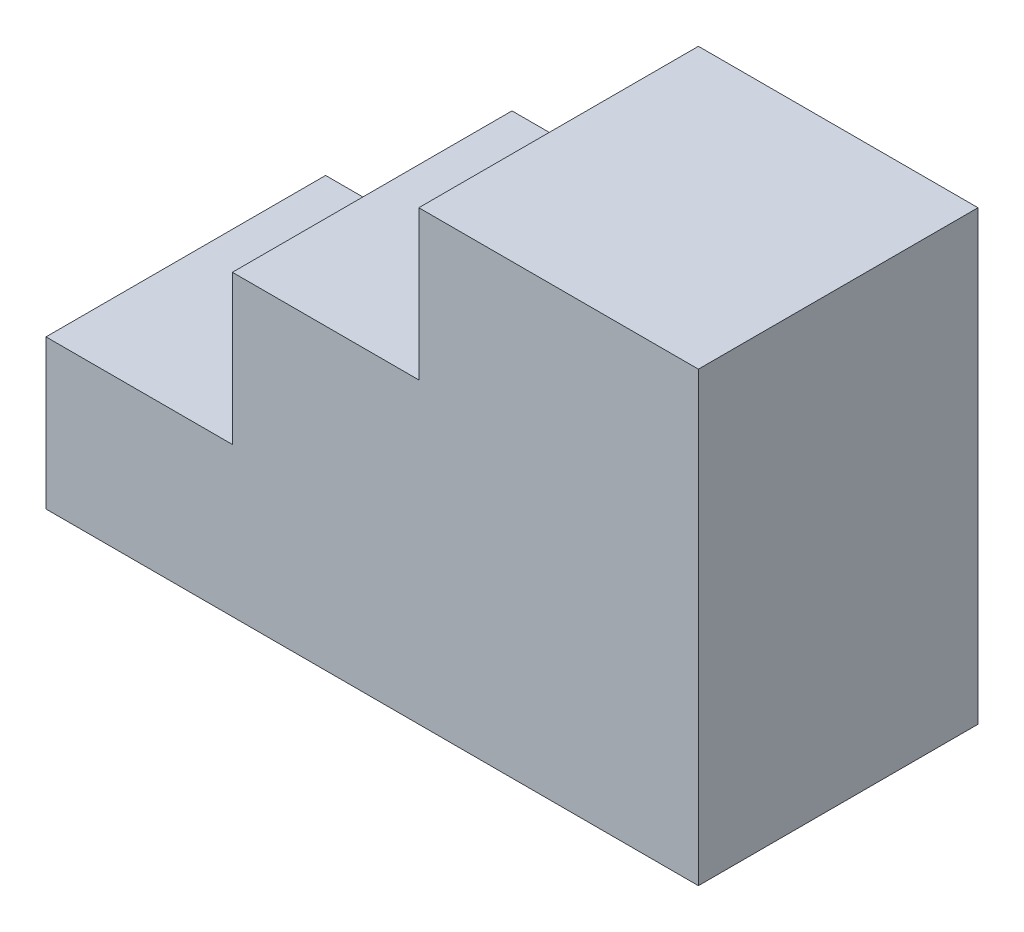
ISO-10303-21;
HEADER;
FILE_DESCRIPTION(('STEP AP214'),'2;1');
FILE_NAME('part.step','',(''),(''),'','','');
FILE_SCHEMA(('AUTOMOTIVE_DESIGN { 1 0 10303 214 1 1 1 1 }'));
ENDSEC;
DATA;
#1=APPLICATION_CONTEXT('core data for automotive mechanical design processes');
#2=APPLICATION_PROTOCOL_DEFINITION('international standard','automotive_design',2000,#1);
#3=PRODUCT_CONTEXT('',#1,'mechanical');
#4=PRODUCT('Part','Part','',(#3));
#5=PRODUCT_RELATED_PRODUCT_CATEGORY('part','',(#4));
#6=PRODUCT_DEFINITION_FORMATION('','',#4);
#7=PRODUCT_DEFINITION_CONTEXT('part definition',#1,'design');
#8=PRODUCT_DEFINITION('design','',#6,#7);
#9=PRODUCT_DEFINITION_SHAPE('','',#8);
#10=(LENGTH_UNIT() NAMED_UNIT(*) SI_UNIT(.MILLI.,.METRE.));
#11=(NAMED_UNIT(*) PLANE_ANGLE_UNIT() SI_UNIT($,.RADIAN.));
#12=(NAMED_UNIT(*) SI_UNIT($,.STERADIAN.) SOLID_ANGLE_UNIT());
#13=UNCERTAINTY_MEASURE_WITH_UNIT(LENGTH_MEASURE(1.E-05),#10,'distance_accuracy_value','');
#14=(GEOMETRIC_REPRESENTATION_CONTEXT(3) GLOBAL_UNCERTAINTY_ASSIGNED_CONTEXT((#13)) GLOBAL_UNIT_ASSIGNED_CONTEXT((#10,
#11,#12)) REPRESENTATION_CONTEXT('',''));
#15=CARTESIAN_POINT('',(0.,0.,0.));
#16=DIRECTION('',(0.,0.,1.));
#17=DIRECTION('',(1.,0.,0.));
#18=AXIS2_PLACEMENT_3D('',#15,#16,#17);
#19=CARTESIAN_POINT('',(-87.5,40.,37.5));
#20=DIRECTION('',(1.,0.,0.));
#21=DIRECTION('',(0.,0.,-1.));
#22=AXIS2_PLACEMENT_3D('',#19,#20,#21);
#23=PLANE('',#22);
#24=DIRECTION('',(0.,-1.,0.));
#25=VECTOR('',#24,1.);
#26=CARTESIAN_POINT('',(-87.5,40.,-37.5));
#27=LINE('',#26,#25);
#28=CARTESIAN_POINT('',(-87.5,40.,-37.5));
#29=VERTEX_POINT('',#28);
#30=CARTESIAN_POINT('',(-87.5,0.,-37.5));
#31=VERTEX_POINT('',#30);
#32=EDGE_CURVE('E135',#29,#31,#27,.T.);
#33=ORIENTED_EDGE('',*,*,#32,.T.);
#34=DIRECTION('',(0.,0.,-1.));
#35=VECTOR('',#34,1.);
#36=CARTESIAN_POINT('',(-87.5,0.,37.5));
#37=LINE('',#36,#35);
#38=CARTESIAN_POINT('',(-87.5,0.,37.5));
#39=VERTEX_POINT('',#38);
#40=EDGE_CURVE('E11',#39,#31,#37,.T.);
#41=ORIENTED_EDGE('',*,*,#40,.F.);
#42=DIRECTION('',(0.,-1.,0.));
#43=VECTOR('',#42,1.);
#44=CARTESIAN_POINT('',(-87.5,40.,37.5));
#45=LINE('',#44,#43);
#46=CARTESIAN_POINT('',(-87.5,40.,37.5));
#47=VERTEX_POINT('',#46);
#48=EDGE_CURVE('E150',#47,#39,#45,.T.);
#49=ORIENTED_EDGE('',*,*,#48,.F.);
#50=DIRECTION('',(0.,0.,-1.));
#51=VECTOR('',#50,1.);
#52=CARTESIAN_POINT('',(-87.5,40.,37.5));
#53=LINE('',#52,#51);
#54=EDGE_CURVE('E131',#47,#29,#53,.T.);
#55=ORIENTED_EDGE('',*,*,#54,.T.);
#56=EDGE_LOOP('',(#33,#41,#49,#55));
#57=FACE_BOUND('',#56,.T.);
#58=ADVANCED_FACE('F39',(#57),#23,.F.);
#59=CARTESIAN_POINT('',(-87.5,0.,37.5));
#60=DIRECTION('',(0.,1.,0.));
#61=DIRECTION('',(0.,0.,1.));
#62=AXIS2_PLACEMENT_3D('',#59,#60,#61);
#63=PLANE('',#62);
#64=CARTESIAN_POINT('',(-50.,0.,0.));
#65=DIRECTION('',(0.,1.,0.));
#66=DIRECTION('',(0.,0.,1.));
#67=AXIS2_PLACEMENT_3D('',#64,#65,#66);
#68=CIRCLE('',#67,4.);
#69=CARTESIAN_POINT('',(-50.,0.,4.));
#70=VERTEX_POINT('',#69);
#71=EDGE_CURVE('E189',#70,#70,#68,.T.);
#72=ORIENTED_EDGE('',*,*,#71,.T.);
#73=EDGE_LOOP('',(#72));
#74=FACE_BOUND('',#73,.T.);
#75=CARTESIAN_POINT('',(50.,0.,0.));
#76=DIRECTION('',(0.,1.,0.));
#77=DIRECTION('',(0.,0.,1.));
#78=AXIS2_PLACEMENT_3D('',#75,#76,#77);
#79=CIRCLE('',#78,4.);
#80=CARTESIAN_POINT('',(50.,0.,4.));
#81=VERTEX_POINT('',#80);
#82=EDGE_CURVE('E186',#81,#81,#79,.T.);
#83=ORIENTED_EDGE('',*,*,#82,.T.);
#84=EDGE_LOOP('',(#83));
#85=FACE_BOUND('',#84,.T.);
#86=DIRECTION('',(1.,0.,0.));
#87=VECTOR('',#86,1.);
#88=CARTESIAN_POINT('',(-87.5,0.,-37.5));
#89=LINE('',#88,#87);
#90=CARTESIAN_POINT('',(87.5,0.,-37.5));
#91=VERTEX_POINT('',#90);
#92=EDGE_CURVE('E138',#31,#91,#89,.T.);
#93=ORIENTED_EDGE('',*,*,#92,.T.);
#94=DIRECTION('',(0.,0.,-1.));
#95=VECTOR('',#94,1.);
#96=CARTESIAN_POINT('',(87.5,0.,37.5));
#97=LINE('',#96,#95);
#98=CARTESIAN_POINT('',(87.5,0.,37.5));
#99=VERTEX_POINT('',#98);
#100=EDGE_CURVE('E47',#99,#91,#97,.T.);
#101=ORIENTED_EDGE('',*,*,#100,.F.);
#102=DIRECTION('',(1.,0.,0.));
#103=VECTOR('',#102,1.);
#104=CARTESIAN_POINT('',(-87.5,0.,37.5));
#105=LINE('',#104,#103);
#106=EDGE_CURVE('E98',#39,#99,#105,.T.);
#107=ORIENTED_EDGE('',*,*,#106,.F.);
#108=ORIENTED_EDGE('',*,*,#40,.T.);
#109=EDGE_LOOP('',(#93,#101,#107,#108));
#110=FACE_BOUND('',#109,.T.);
#111=ADVANCED_FACE('F207',(#74,#85,#110),#63,.F.);
#112=CARTESIAN_POINT('',(87.5,0.,37.5));
#113=DIRECTION('',(-1.,0.,0.));
#114=DIRECTION('',(0.,0.,1.));
#115=AXIS2_PLACEMENT_3D('',#112,#113,#114);
#116=PLANE('',#115);
#117=DIRECTION('',(0.,1.,0.));
#118=VECTOR('',#117,1.);
#119=CARTESIAN_POINT('',(87.5,0.,-37.5));
#120=LINE('',#119,#118);
#121=CARTESIAN_POINT('',(87.5,120.,-37.5));
#122=VERTEX_POINT('',#121);
#123=EDGE_CURVE('E141',#91,#122,#120,.T.);
#124=ORIENTED_EDGE('',*,*,#123,.T.);
#125=DIRECTION('',(0.,0.,-1.));
#126=VECTOR('',#125,1.);
#127=CARTESIAN_POINT('',(87.5,120.,37.5));
#128=LINE('',#127,#126);
#129=CARTESIAN_POINT('',(87.5,120.,37.5));
#130=VERTEX_POINT('',#129);
#131=EDGE_CURVE('E157',#130,#122,#128,.T.);
#132=ORIENTED_EDGE('',*,*,#131,.F.);
#133=DIRECTION('',(0.,1.,0.));
#134=VECTOR('',#133,1.);
#135=CARTESIAN_POINT('',(87.5,0.,37.5));
#136=LINE('',#135,#134);
#137=EDGE_CURVE('E165',#99,#130,#136,.T.);
#138=ORIENTED_EDGE('',*,*,#137,.F.);
#139=ORIENTED_EDGE('',*,*,#100,.T.);
#140=EDGE_LOOP('',(#124,#132,#138,#139));
#141=FACE_BOUND('',#140,.T.);
#142=ADVANCED_FACE('F163',(#141),#116,.F.);
#143=CARTESIAN_POINT('',(87.5,120.,37.5));
#144=DIRECTION('',(0.,-1.,0.));
#145=DIRECTION('',(0.,0.,-1.));
#146=AXIS2_PLACEMENT_3D('',#143,#144,#145);
#147=PLANE('',#146);
#148=DIRECTION('',(-1.,0.,0.));
#149=VECTOR('',#148,1.);
#150=CARTESIAN_POINT('',(87.5,120.,-37.5));
#151=LINE('',#150,#149);
#152=CARTESIAN_POINT('',(12.5,120.,-37.5));
#153=VERTEX_POINT('',#152);
#154=EDGE_CURVE('E143',#122,#153,#151,.T.);
#155=ORIENTED_EDGE('',*,*,#154,.T.);
#156=DIRECTION('',(0.,0.,-1.));
#157=VECTOR('',#156,1.);
#158=CARTESIAN_POINT('',(12.5,120.,37.5));
#159=LINE('',#158,#157);
#160=CARTESIAN_POINT('',(12.5,120.,37.5));
#161=VERTEX_POINT('',#160);
#162=EDGE_CURVE('E154',#161,#153,#159,.T.);
#163=ORIENTED_EDGE('',*,*,#162,.F.);
#164=DIRECTION('',(-1.,0.,0.));
#165=VECTOR('',#164,1.);
#166=CARTESIAN_POINT('',(87.5,120.,37.5));
#167=LINE('',#166,#165);
#168=EDGE_CURVE('E177',#130,#161,#167,.T.);
#169=ORIENTED_EDGE('',*,*,#168,.F.);
#170=ORIENTED_EDGE('',*,*,#131,.T.);
#171=EDGE_LOOP('',(#155,#163,#169,#170));
#172=FACE_BOUND('',#171,.T.);
#173=ADVANCED_FACE('F173',(#172),#147,.F.);
#174=CARTESIAN_POINT('',(12.5,120.,37.5));
#175=DIRECTION('',(1.,0.,0.));
#176=DIRECTION('',(0.,0.,-1.));
#177=AXIS2_PLACEMENT_3D('',#174,#175,#176);
#178=PLANE('',#177);
#179=DIRECTION('',(0.,-1.,0.));
#180=VECTOR('',#179,1.);
#181=CARTESIAN_POINT('',(12.5,120.,-37.5));
#182=LINE('',#181,#180);
#183=CARTESIAN_POINT('',(12.5,80.,-37.5));
#184=VERTEX_POINT('',#183);
#185=EDGE_CURVE('E145',#153,#184,#182,.T.);
#186=ORIENTED_EDGE('',*,*,#185,.T.);
#187=DIRECTION('',(0.,0.,-1.));
#188=VECTOR('',#187,1.);
#189=CARTESIAN_POINT('',(12.5,80.,37.5));
#190=LINE('',#189,#188);
#191=CARTESIAN_POINT('',(12.5,80.,37.5));
#192=VERTEX_POINT('',#191);
#193=EDGE_CURVE('E126',#192,#184,#190,.T.);
#194=ORIENTED_EDGE('',*,*,#193,.F.);
#195=DIRECTION('',(0.,-1.,0.));
#196=VECTOR('',#195,1.);
#197=CARTESIAN_POINT('',(12.5,120.,37.5));
#198=LINE('',#197,#196);
#199=EDGE_CURVE('E117',#161,#192,#198,.T.);
#200=ORIENTED_EDGE('',*,*,#199,.F.);
#201=ORIENTED_EDGE('',*,*,#162,.T.);
#202=EDGE_LOOP('',(#186,#194,#200,#201));
#203=FACE_BOUND('',#202,.T.);
#204=ADVANCED_FACE('F176',(#203),#178,.F.);
#205=CARTESIAN_POINT('',(12.5,80.,37.5));
#206=DIRECTION('',(0.,-1.,0.));
#207=DIRECTION('',(0.,0.,-1.));
#208=AXIS2_PLACEMENT_3D('',#205,#206,#207);
#209=PLANE('',#208);
#210=DIRECTION('',(-1.,0.,0.));
#211=VECTOR('',#210,1.);
#212=CARTESIAN_POINT('',(12.5,80.,-37.5));
#213=LINE('',#212,#211);
#214=CARTESIAN_POINT('',(-37.5,80.,-37.5));
#215=VERTEX_POINT('',#214);
#216=EDGE_CURVE('E125',#184,#215,#213,.T.);
#217=ORIENTED_EDGE('',*,*,#216,.T.);
#218=DIRECTION('',(0.,0.,-1.));
#219=VECTOR('',#218,1.);
#220=CARTESIAN_POINT('',(-37.5,80.,37.5));
#221=LINE('',#220,#219);
#222=CARTESIAN_POINT('',(-37.5,80.,37.5));
#223=VERTEX_POINT('',#222);
#224=EDGE_CURVE('E122',#223,#215,#221,.T.);
#225=ORIENTED_EDGE('',*,*,#224,.F.);
#226=DIRECTION('',(-1.,0.,0.));
#227=VECTOR('',#226,1.);
#228=CARTESIAN_POINT('',(12.5,80.,37.5));
#229=LINE('',#228,#227);
#230=EDGE_CURVE('E111',#192,#223,#229,.T.);
#231=ORIENTED_EDGE('',*,*,#230,.F.);
#232=ORIENTED_EDGE('',*,*,#193,.T.);
#233=EDGE_LOOP('',(#217,#225,#231,#232));
#234=FACE_BOUND('',#233,.T.);
#235=ADVANCED_FACE('F123',(#234),#209,.F.);
#236=CARTESIAN_POINT('',(-37.5,80.,37.5));
#237=DIRECTION('',(1.,0.,0.));
#238=DIRECTION('',(0.,0.,-1.));
#239=AXIS2_PLACEMENT_3D('',#236,#237,#238);
#240=PLANE('',#239);
#241=DIRECTION('',(0.,-1.,0.));
#242=VECTOR('',#241,1.);
#243=CARTESIAN_POINT('',(-37.5,80.,-37.5));
#244=LINE('',#243,#242);
#245=CARTESIAN_POINT('',(-37.5,40.,-37.5));
#246=VERTEX_POINT('',#245);
#247=EDGE_CURVE('E84',#215,#246,#244,.T.);
#248=ORIENTED_EDGE('',*,*,#247,.T.);
#249=DIRECTION('',(0.,0.,-1.));
#250=VECTOR('',#249,1.);
#251=CARTESIAN_POINT('',(-37.5,40.,37.5));
#252=LINE('',#251,#250);
#253=CARTESIAN_POINT('',(-37.5,40.,37.5));
#254=VERTEX_POINT('',#253);
#255=EDGE_CURVE('E127',#254,#246,#252,.T.);
#256=ORIENTED_EDGE('',*,*,#255,.F.);
#257=DIRECTION('',(0.,-1.,0.));
#258=VECTOR('',#257,1.);
#259=CARTESIAN_POINT('',(-37.5,80.,37.5));
#260=LINE('',#259,#258);
#261=EDGE_CURVE('E115',#223,#254,#260,.T.);
#262=ORIENTED_EDGE('',*,*,#261,.F.);
#263=ORIENTED_EDGE('',*,*,#224,.T.);
#264=EDGE_LOOP('',(#248,#256,#262,#263));
#265=FACE_BOUND('',#264,.T.);
#266=ADVANCED_FACE('F129',(#265),#240,.F.);
#267=CARTESIAN_POINT('',(-37.5,40.,37.5));
#268=DIRECTION('',(0.,-1.,0.));
#269=DIRECTION('',(0.,0.,-1.));
#270=AXIS2_PLACEMENT_3D('',#267,#268,#269);
#271=PLANE('',#270);
#272=DIRECTION('',(-1.,0.,0.));
#273=VECTOR('',#272,1.);
#274=CARTESIAN_POINT('',(-37.5,40.,-37.5));
#275=LINE('',#274,#273);
#276=EDGE_CURVE('E90',#246,#29,#275,.T.);
#277=ORIENTED_EDGE('',*,*,#276,.T.);
#278=ORIENTED_EDGE('',*,*,#54,.F.);
#279=DIRECTION('',(-1.,0.,0.));
#280=VECTOR('',#279,1.);
#281=CARTESIAN_POINT('',(-37.5,40.,37.5));
#282=LINE('',#281,#280);
#283=EDGE_CURVE('E55',#254,#47,#282,.T.);
#284=ORIENTED_EDGE('',*,*,#283,.F.);
#285=ORIENTED_EDGE('',*,*,#255,.T.);
#286=EDGE_LOOP('',(#277,#278,#284,#285));
#287=FACE_BOUND('',#286,.T.);
#288=ADVANCED_FACE('F216',(#287),#271,.F.);
#289=CARTESIAN_POINT('',(0.,0.,37.5));
#290=DIRECTION('',(0.,0.,1.));
#291=DIRECTION('',(1.,0.,0.));
#292=AXIS2_PLACEMENT_3D('',#289,#290,#291);
#293=PLANE('',#292);
#294=ORIENTED_EDGE('',*,*,#48,.T.);
#295=ORIENTED_EDGE('',*,*,#106,.T.);
#296=ORIENTED_EDGE('',*,*,#137,.T.);
#297=ORIENTED_EDGE('',*,*,#168,.T.);
#298=ORIENTED_EDGE('',*,*,#199,.T.);
#299=ORIENTED_EDGE('',*,*,#230,.T.);
#300=ORIENTED_EDGE('',*,*,#261,.T.);
#301=ORIENTED_EDGE('',*,*,#283,.T.);
#302=EDGE_LOOP('',(#294,#295,#296,#297,#298,#299,#300,#301));
#303=FACE_BOUND('',#302,.T.);
#304=ADVANCED_FACE('F113',(#303),#293,.T.);
#305=CARTESIAN_POINT('',(0.,0.,-37.5));
#306=DIRECTION('',(0.,0.,1.));
#307=DIRECTION('',(1.,0.,0.));
#308=AXIS2_PLACEMENT_3D('',#305,#306,#307);
#309=PLANE('',#308);
#310=ORIENTED_EDGE('',*,*,#32,.F.);
#311=ORIENTED_EDGE('',*,*,#276,.F.);
#312=ORIENTED_EDGE('',*,*,#247,.F.);
#313=ORIENTED_EDGE('',*,*,#216,.F.);
#314=ORIENTED_EDGE('',*,*,#185,.F.);
#315=ORIENTED_EDGE('',*,*,#154,.F.);
#316=ORIENTED_EDGE('',*,*,#123,.F.);
#317=ORIENTED_EDGE('',*,*,#92,.F.);
#318=EDGE_LOOP('',(#310,#311,#312,#313,#314,#315,#316,#317));
#319=FACE_BOUND('',#318,.T.);
#320=ADVANCED_FACE('F169',(#319),#309,.F.);
#321=CARTESIAN_POINT('',(50.,14.,0.));
#322=DIRECTION('',(0.,-1.,0.));
#323=DIRECTION('',(0.,0.,-1.));
#324=AXIS2_PLACEMENT_3D('',#321,#322,#323);
#325=CYLINDRICAL_SURFACE('',#324,4.);
#326=CARTESIAN_POINT('',(50.,14.,0.));
#327=DIRECTION('',(0.,1.,0.));
#328=DIRECTION('',(0.,0.,1.));
#329=AXIS2_PLACEMENT_3D('',#326,#327,#328);
#330=CIRCLE('',#329,4.);
#331=CARTESIAN_POINT('',(50.,14.,4.));
#332=VERTEX_POINT('',#331);
#333=EDGE_CURVE('E183',#332,#332,#330,.T.);
#334=ORIENTED_EDGE('',*,*,#333,.T.);
#335=EDGE_LOOP('',(#334));
#336=FACE_BOUND('',#335,.T.);
#337=ORIENTED_EDGE('',*,*,#82,.F.);
#338=EDGE_LOOP('',(#337));
#339=FACE_BOUND('',#338,.T.);
#340=ADVANCED_FACE('F276',(#336,#339),#325,.F.);
#341=CARTESIAN_POINT('',(50.,14.,0.));
#342=DIRECTION('',(0.,1.,0.));
#343=DIRECTION('',(0.,0.,1.));
#344=AXIS2_PLACEMENT_3D('',#341,#342,#343);
#345=PLANE('',#344);
#346=ORIENTED_EDGE('',*,*,#333,.F.);
#347=EDGE_LOOP('',(#346));
#348=FACE_BOUND('',#347,.T.);
#349=ADVANCED_FACE('F204',(#348),#345,.F.);
#350=CARTESIAN_POINT('',(-50.,14.,0.));
#351=DIRECTION('',(0.,-1.,0.));
#352=DIRECTION('',(0.,0.,-1.));
#353=AXIS2_PLACEMENT_3D('',#350,#351,#352);
#354=CYLINDRICAL_SURFACE('',#353,4.);
#355=CARTESIAN_POINT('',(-50.,14.,0.));
#356=DIRECTION('',(0.,1.,0.));
#357=DIRECTION('',(0.,0.,1.));
#358=AXIS2_PLACEMENT_3D('',#355,#356,#357);
#359=CIRCLE('',#358,4.);
#360=CARTESIAN_POINT('',(-50.,14.,4.));
#361=VERTEX_POINT('',#360);
#362=EDGE_CURVE('E139',#361,#361,#359,.T.);
#363=ORIENTED_EDGE('',*,*,#362,.T.);
#364=EDGE_LOOP('',(#363));
#365=FACE_BOUND('',#364,.T.);
#366=ORIENTED_EDGE('',*,*,#71,.F.);
#367=EDGE_LOOP('',(#366));
#368=FACE_BOUND('',#367,.T.);
#369=ADVANCED_FACE('F195',(#365,#368),#354,.F.);
#370=CARTESIAN_POINT('',(-50.,14.,0.));
#371=DIRECTION('',(0.,1.,0.));
#372=DIRECTION('',(0.,0.,1.));
#373=AXIS2_PLACEMENT_3D('',#370,#371,#372);
#374=PLANE('',#373);
#375=ORIENTED_EDGE('',*,*,#362,.F.);
#376=EDGE_LOOP('',(#375));
#377=FACE_BOUND('',#376,.T.);
#378=ADVANCED_FACE('F198',(#377),#374,.F.);
#379=CLOSED_SHELL('',(#58,#111,#142,#173,#204,#235,#266,#288,#304,#320,#340,#349,#369,#378));
#380=MANIFOLD_SOLID_BREP('B2',#379);
#381=ADVANCED_BREP_SHAPE_REPRESENTATION('',(#18,#380),#14);
#382=SHAPE_DEFINITION_REPRESENTATION(#9,#381);
ENDSEC;
END-ISO-10303-21;
